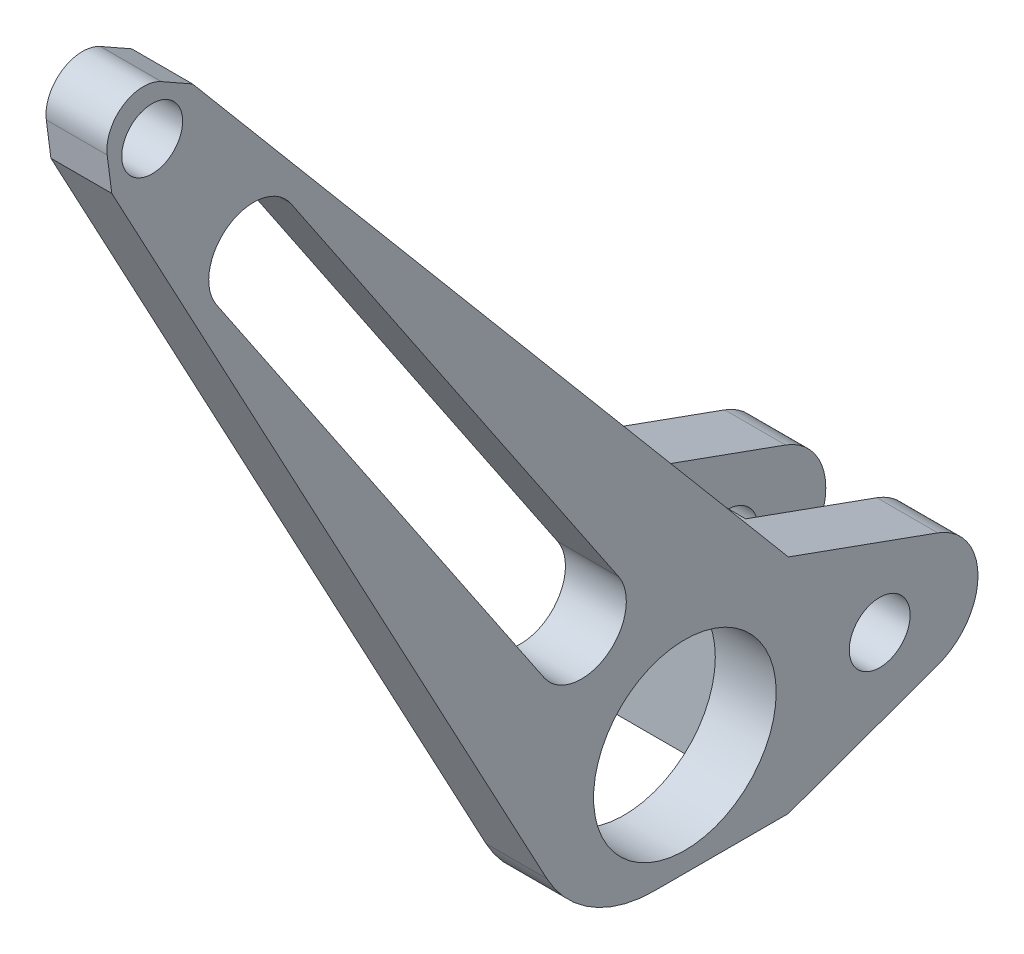
ISO-10303-21;
HEADER;
FILE_DESCRIPTION(('STEP AP214'),'2;1');
FILE_NAME('part.step','',(''),(''),'','','');
FILE_SCHEMA(('AUTOMOTIVE_DESIGN { 1 0 10303 214 1 1 1 1 }'));
ENDSEC;
DATA;
#1=APPLICATION_CONTEXT('core data for automotive mechanical design processes');
#2=APPLICATION_PROTOCOL_DEFINITION('international standard','automotive_design',2000,#1);
#3=PRODUCT_CONTEXT('',#1,'mechanical');
#4=PRODUCT('Part','Part','',(#3));
#5=PRODUCT_RELATED_PRODUCT_CATEGORY('part','',(#4));
#6=PRODUCT_DEFINITION_FORMATION('','',#4);
#7=PRODUCT_DEFINITION_CONTEXT('part definition',#1,'design');
#8=PRODUCT_DEFINITION('design','',#6,#7);
#9=PRODUCT_DEFINITION_SHAPE('','',#8);
#10=(LENGTH_UNIT() NAMED_UNIT(*) SI_UNIT(.MILLI.,.METRE.));
#11=(NAMED_UNIT(*) PLANE_ANGLE_UNIT() SI_UNIT($,.RADIAN.));
#12=(NAMED_UNIT(*) SI_UNIT($,.STERADIAN.) SOLID_ANGLE_UNIT());
#13=UNCERTAINTY_MEASURE_WITH_UNIT(LENGTH_MEASURE(1.E-05),#10,'distance_accuracy_value','');
#14=(GEOMETRIC_REPRESENTATION_CONTEXT(3) GLOBAL_UNCERTAINTY_ASSIGNED_CONTEXT((#13)) GLOBAL_UNIT_ASSIGNED_CONTEXT((#10,
#11,#12)) REPRESENTATION_CONTEXT('',''));
#15=CARTESIAN_POINT('',(0.,0.,0.));
#16=DIRECTION('',(0.,0.,1.));
#17=DIRECTION('',(1.,0.,0.));
#18=AXIS2_PLACEMENT_3D('',#15,#16,#17);
#19=CARTESIAN_POINT('',(-25.,-17.1695442609699,-20.));
#20=DIRECTION('',(0.,0.,-1.));
#21=DIRECTION('',(0.,1.,0.));
#22=AXIS2_PLACEMENT_3D('',#19,#20,#21);
#23=PLANE('',#22);
#24=DIRECTION('',(1.,0.,0.));
#25=VECTOR('',#24,1.);
#26=CARTESIAN_POINT('',(-25.,-17.1695442609699,-20.));
#27=LINE('',#26,#25);
#28=CARTESIAN_POINT('',(-15.,-17.1695442609699,-20.));
#29=VERTEX_POINT('',#28);
#30=CARTESIAN_POINT('',(0.,-17.1695442609699,-20.));
#31=VERTEX_POINT('',#30);
#32=EDGE_CURVE('E56',#29,#31,#27,.T.);
#33=ORIENTED_EDGE('',*,*,#32,.F.);
#34=DIRECTION('',(0.,1.,0.));
#35=VECTOR('',#34,1.);
#36=CARTESIAN_POINT('',(-15.,0.,-20.));
#37=LINE('',#36,#35);
#38=CARTESIAN_POINT('',(-15.,17.16954426097,-20.));
#39=VERTEX_POINT('',#38);
#40=EDGE_CURVE('E51',#29,#39,#37,.T.);
#41=ORIENTED_EDGE('',*,*,#40,.T.);
#42=DIRECTION('',(1.,0.,0.));
#43=VECTOR('',#42,1.);
#44=CARTESIAN_POINT('',(-25.,17.16954426097,-20.));
#45=LINE('',#44,#43);
#46=CARTESIAN_POINT('',(0.,17.16954426097,-20.));
#47=VERTEX_POINT('',#46);
#48=EDGE_CURVE('E208',#39,#47,#45,.T.);
#49=ORIENTED_EDGE('',*,*,#48,.T.);
#50=DIRECTION('',(0.,1.,0.));
#51=VECTOR('',#50,1.);
#52=CARTESIAN_POINT('',(0.,-17.1695442609699,-20.));
#53=LINE('',#52,#51);
#54=EDGE_CURVE('E199',#31,#47,#53,.T.);
#55=ORIENTED_EDGE('',*,*,#54,.F.);
#56=EDGE_LOOP('',(#33,#41,#49,#55));
#57=FACE_BOUND('',#56,.T.);
#58=ADVANCED_FACE('F36',(#57),#23,.T.);
#59=CARTESIAN_POINT('',(0.,0.,-38.1492996902775));
#60=DIRECTION('',(1.,0.,0.));
#61=DIRECTION('',(0.,0.,-1.));
#62=AXIS2_PLACEMENT_3D('',#59,#60,#61);
#63=PLANE('',#62);
#64=CARTESIAN_POINT('',(0.,105.23639134039,70.8321864791089));
#65=DIRECTION('',(1.,0.,0.));
#66=DIRECTION('',(0.,0.,-1.));
#67=AXIS2_PLACEMENT_3D('',#64,#65,#66);
#68=CIRCLE('',#67,7.38136059513586);
#69=CARTESIAN_POINT('',(0.,109.357968664756,64.7087001686234));
#70=VERTEX_POINT('',#69);
#71=CARTESIAN_POINT('',(0.,101.114814016025,76.9556727895943));
#72=VERTEX_POINT('',#71);
#73=EDGE_CURVE('E210',#70,#72,#68,.T.);
#74=ORIENTED_EDGE('',*,*,#73,.T.);
#75=DIRECTION('',(0.,-0.829587747619415,-0.558376368589991));
#76=VECTOR('',#75,1.);
#77=CARTESIAN_POINT('',(0.,101.114814016025,76.9556727895943));
#78=LINE('',#77,#76);
#79=CARTESIAN_POINT('',(0.,21.1355655327776,23.1234863104855));
#80=VERTEX_POINT('',#79);
#81=EDGE_CURVE('E227',#72,#80,#78,.T.);
#82=ORIENTED_EDGE('',*,*,#81,.T.);
#83=CARTESIAN_POINT('',(0.,25.2571428571428,17.));
#84=DIRECTION('',(1.,0.,0.));
#85=DIRECTION('',(0.,0.,-1.));
#86=AXIS2_PLACEMENT_3D('',#83,#84,#85);
#87=CIRCLE('',#86,7.38136059513586);
#88=CARTESIAN_POINT('',(0.,29.3787201815081,10.8765136895145));
#89=VERTEX_POINT('',#88);
#90=EDGE_CURVE('E230',#80,#89,#87,.T.);
#91=ORIENTED_EDGE('',*,*,#90,.T.);
#92=DIRECTION('',(0.,0.829587747619415,0.558376368589991));
#93=VECTOR('',#92,1.);
#94=CARTESIAN_POINT('',(0.,109.357968664756,64.7087001686234));
#95=LINE('',#94,#93);
#96=EDGE_CURVE('E217',#89,#70,#95,.T.);
#97=ORIENTED_EDGE('',*,*,#96,.T.);
#98=EDGE_LOOP('',(#74,#82,#91,#97));
#99=FACE_BOUND('',#98,.T.);
#100=CARTESIAN_POINT('',(0.,0.,0.));
#101=DIRECTION('',(1.,0.,0.));
#102=DIRECTION('',(0.,0.,-1.));
#103=AXIS2_PLACEMENT_3D('',#100,#101,#102);
#104=CIRCLE('',#103,15.);
#105=CARTESIAN_POINT('',(0.,0.,-15.));
#106=VERTEX_POINT('',#105);
#107=EDGE_CURVE('E254',#106,#106,#104,.T.);
#108=ORIENTED_EDGE('',*,*,#107,.T.);
#109=EDGE_LOOP('',(#108));
#110=FACE_BOUND('',#109,.T.);
#111=CARTESIAN_POINT('',(0.,130.,87.5));
#112=DIRECTION('',(1.,0.,0.));
#113=DIRECTION('',(0.,0.,-1.));
#114=AXIS2_PLACEMENT_3D('',#111,#112,#113);
#115=CIRCLE('',#114,5.00000000000001);
#116=CARTESIAN_POINT('',(0.,130.,82.5));
#117=VERTEX_POINT('',#116);
#118=EDGE_CURVE('E248',#117,#117,#115,.T.);
#119=ORIENTED_EDGE('',*,*,#118,.T.);
#120=EDGE_LOOP('',(#119));
#121=FACE_BOUND('',#120,.T.);
#122=DIRECTION('',(0.,0.764921441974797,0.644123581005382));
#123=VECTOR('',#122,1.);
#124=CARTESIAN_POINT('',(0.,134.46701094872,80.8632980190447));
#125=LINE('',#124,#123);
#126=CARTESIAN_POINT('',(0.,18.2505934092546,-17.));
#127=VERTEX_POINT('',#126);
#128=CARTESIAN_POINT('',(0.,134.46701094872,80.8632980190447));
#129=VERTEX_POINT('',#128);
#130=EDGE_CURVE('E260',#127,#129,#125,.T.);
#131=ORIENTED_EDGE('',*,*,#130,.F.);
#132=DIRECTION('',(0.,-1.,0.));
#133=VECTOR('',#132,1.);
#134=CARTESIAN_POINT('',(0.,18.2505934092546,-17.));
#135=LINE('',#134,#133);
#136=CARTESIAN_POINT('',(0.,-18.2505934092547,-17.));
#137=VERTEX_POINT('',#136);
#138=EDGE_CURVE('E195',#127,#137,#135,.T.);
#139=ORIENTED_EDGE('',*,*,#138,.T.);
#140=DIRECTION('',(0.,0.,-1.));
#141=VECTOR('',#140,1.);
#142=CARTESIAN_POINT('',(0.,-18.2505934092547,-17.));
#143=LINE('',#142,#141);
#144=CARTESIAN_POINT('',(0.,-18.2505934092547,5.03322666364754));
#145=VERTEX_POINT('',#144);
#146=EDGE_CURVE('E298',#145,#137,#143,.T.);
#147=ORIENTED_EDGE('',*,*,#146,.F.);
#148=CARTESIAN_POINT('',(0.,1.74940659074534,5.03322666364764));
#149=DIRECTION('',(1.,0.,0.));
#150=DIRECTION('',(0.,0.,-1.));
#151=AXIS2_PLACEMENT_3D('',#148,#149,#150);
#152=CIRCLE('',#151,20.);
#153=CARTESIAN_POINT('',(0.,-7.70547572672104,22.6572216807504));
#154=VERTEX_POINT('',#153);
#155=EDGE_CURVE('E296',#154,#145,#152,.T.);
#156=ORIENTED_EDGE('',*,*,#155,.F.);
#157=DIRECTION('',(0.,-0.881199750855134,-0.472744115873323));
#158=VECTOR('',#157,1.);
#159=CARTESIAN_POINT('',(0.,125.53298905128,94.1367019809553));
#160=LINE('',#159,#158);
#161=CARTESIAN_POINT('',(0.,125.53298905128,94.1367019809553));
#162=VERTEX_POINT('',#161);
#163=EDGE_CURVE('E294',#162,#154,#160,.T.);
#164=ORIENTED_EDGE('',*,*,#163,.F.);
#165=DIRECTION('',(0.,-0.99171934223052,-0.12842408748309));
#166=VECTOR('',#165,1.);
#167=CARTESIAN_POINT('',(0.,131.372771855144,94.8929328476428));
#168=LINE('',#167,#166);
#169=CARTESIAN_POINT('',(0.,131.372771855144,94.8929328476428));
#170=VERTEX_POINT('',#169);
#171=EDGE_CURVE('E292',#170,#162,#168,.T.);
#172=ORIENTED_EDGE('',*,*,#171,.F.);
#173=CARTESIAN_POINT('',(0.,132.143316380043,88.9426167942597));
#174=DIRECTION('',(1.,0.,0.));
#175=DIRECTION('',(0.,0.,-1.));
#176=AXIS2_PLACEMENT_3D('',#173,#174,#175);
#177=CIRCLE('',#176,6.);
#178=CARTESIAN_POINT('',(0.,137.365895937689,85.9888627821486));
#179=VERTEX_POINT('',#178);
#180=EDGE_CURVE('E290',#179,#170,#177,.T.);
#181=ORIENTED_EDGE('',*,*,#180,.F.);
#182=DIRECTION('',(0.,0.492292335351843,0.870429926274269));
#183=VECTOR('',#182,1.);
#184=CARTESIAN_POINT('',(0.,134.46701094872,80.8632980190447));
#185=LINE('',#184,#183);
#186=EDGE_CURVE('E288',#129,#179,#185,.T.);
#187=ORIENTED_EDGE('',*,*,#186,.F.);
#188=EDGE_LOOP('',(#131,#139,#147,#156,#164,#172,#181,#187));
#189=FACE_BOUND('',#188,.T.);
#190=ADVANCED_FACE('F339',(#99,#110,#121,#189),#63,.F.);
#191=CARTESIAN_POINT('',(10.,0.,-38.1492996902775));
#192=DIRECTION('',(1.,0.,0.));
#193=DIRECTION('',(0.,0.,-1.));
#194=AXIS2_PLACEMENT_3D('',#191,#192,#193);
#195=PLANE('',#194);
#196=CARTESIAN_POINT('',(10.,130.,87.5));
#197=DIRECTION('',(1.,0.,0.));
#198=DIRECTION('',(0.,0.,-1.));
#199=AXIS2_PLACEMENT_3D('',#196,#197,#198);
#200=CIRCLE('',#199,5.00000000000001);
#201=CARTESIAN_POINT('',(10.,130.,82.5));
#202=VERTEX_POINT('',#201);
#203=EDGE_CURVE('E251',#202,#202,#200,.T.);
#204=ORIENTED_EDGE('',*,*,#203,.F.);
#205=EDGE_LOOP('',(#204));
#206=FACE_BOUND('',#205,.T.);
#207=DIRECTION('',(0.,0.764921441974797,0.644123581005382));
#208=VECTOR('',#207,1.);
#209=CARTESIAN_POINT('',(10.,134.46701094872,80.8632980190447));
#210=LINE('',#209,#208);
#211=CARTESIAN_POINT('',(10.,18.2505934092547,-17.));
#212=VERTEX_POINT('',#211);
#213=CARTESIAN_POINT('',(10.,134.46701094872,80.8632980190447));
#214=VERTEX_POINT('',#213);
#215=EDGE_CURVE('E263',#212,#214,#210,.T.);
#216=ORIENTED_EDGE('',*,*,#215,.T.);
#217=DIRECTION('',(0.,0.492292335351843,0.870429926274269));
#218=VECTOR('',#217,1.);
#219=CARTESIAN_POINT('',(10.,134.46701094872,80.8632980190447));
#220=LINE('',#219,#218);
#221=CARTESIAN_POINT('',(10.,137.365895937689,85.9888627821486));
#222=VERTEX_POINT('',#221);
#223=EDGE_CURVE('E266',#214,#222,#220,.T.);
#224=ORIENTED_EDGE('',*,*,#223,.T.);
#225=CARTESIAN_POINT('',(10.,132.143316380043,88.9426167942597));
#226=DIRECTION('',(1.,0.,0.));
#227=DIRECTION('',(0.,0.,-1.));
#228=AXIS2_PLACEMENT_3D('',#225,#226,#227);
#229=CIRCLE('',#228,6.);
#230=CARTESIAN_POINT('',(10.,131.372771855144,94.8929328476428));
#231=VERTEX_POINT('',#230);
#232=EDGE_CURVE('E269',#222,#231,#229,.T.);
#233=ORIENTED_EDGE('',*,*,#232,.T.);
#234=DIRECTION('',(0.,-0.99171934223052,-0.12842408748309));
#235=VECTOR('',#234,1.);
#236=CARTESIAN_POINT('',(10.,131.372771855144,94.8929328476428));
#237=LINE('',#236,#235);
#238=CARTESIAN_POINT('',(10.,125.53298905128,94.1367019809553));
#239=VERTEX_POINT('',#238);
#240=EDGE_CURVE('E271',#231,#239,#237,.T.);
#241=ORIENTED_EDGE('',*,*,#240,.T.);
#242=DIRECTION('',(0.,-0.881199750855134,-0.472744115873323));
#243=VECTOR('',#242,1.);
#244=CARTESIAN_POINT('',(10.,125.53298905128,94.1367019809553));
#245=LINE('',#244,#243);
#246=CARTESIAN_POINT('',(10.,-7.70547572672104,22.6572216807504));
#247=VERTEX_POINT('',#246);
#248=EDGE_CURVE('E273',#239,#247,#245,.T.);
#249=ORIENTED_EDGE('',*,*,#248,.T.);
#250=CARTESIAN_POINT('',(10.,1.74940659074534,5.03322666364764));
#251=DIRECTION('',(1.,0.,0.));
#252=DIRECTION('',(0.,0.,-1.));
#253=AXIS2_PLACEMENT_3D('',#250,#251,#252);
#254=CIRCLE('',#253,20.);
#255=CARTESIAN_POINT('',(10.,-18.2505934092547,5.03322666364754));
#256=VERTEX_POINT('',#255);
#257=EDGE_CURVE('E275',#247,#256,#254,.T.);
#258=ORIENTED_EDGE('',*,*,#257,.T.);
#259=DIRECTION('',(0.,0.,-1.));
#260=VECTOR('',#259,1.);
#261=CARTESIAN_POINT('',(10.,-18.2505934092547,-17.));
#262=LINE('',#261,#260);
#263=CARTESIAN_POINT('',(10.,-18.2505934092547,-17.));
#264=VERTEX_POINT('',#263);
#265=EDGE_CURVE('E277',#256,#264,#262,.T.);
#266=ORIENTED_EDGE('',*,*,#265,.T.);
#267=DIRECTION('',(0.,0.339010711592773,-0.940782513350116));
#268=VECTOR('',#267,1.);
#269=CARTESIAN_POINT('',(10.,-9.40782513350104,-41.5394068062052));
#270=LINE('',#269,#268);
#271=CARTESIAN_POINT('',(10.,-9.40782513350115,-41.5394068062053));
#272=VERTEX_POINT('',#271);
#273=EDGE_CURVE('E279',#264,#272,#270,.T.);
#274=ORIENTED_EDGE('',*,*,#273,.T.);
#275=CARTESIAN_POINT('',(10.,0.,-38.1492996902775));
#276=DIRECTION('',(1.,0.,0.));
#277=DIRECTION('',(0.,0.,-1.));
#278=AXIS2_PLACEMENT_3D('',#275,#276,#277);
#279=CIRCLE('',#278,10.);
#280=CARTESIAN_POINT('',(10.,9.40782513350131,-41.5394068062052));
#281=VERTEX_POINT('',#280);
#282=EDGE_CURVE('E281',#272,#281,#279,.T.);
#283=ORIENTED_EDGE('',*,*,#282,.T.);
#284=DIRECTION('',(0.,0.339010711592765,0.940782513350119));
#285=VECTOR('',#284,1.);
#286=CARTESIAN_POINT('',(10.,18.2505934092547,-17.));
#287=LINE('',#286,#285);
#288=EDGE_CURVE('E283',#281,#212,#287,.T.);
#289=ORIENTED_EDGE('',*,*,#288,.T.);
#290=EDGE_LOOP('',(#216,#224,#233,#241,#249,#258,#266,#274,#283,#289));
#291=FACE_BOUND('',#290,.T.);
#292=CARTESIAN_POINT('',(10.,0.,0.));
#293=DIRECTION('',(1.,0.,0.));
#294=DIRECTION('',(0.,0.,-1.));
#295=AXIS2_PLACEMENT_3D('',#292,#293,#294);
#296=CIRCLE('',#295,15.);
#297=CARTESIAN_POINT('',(10.,0.,-15.));
#298=VERTEX_POINT('',#297);
#299=EDGE_CURVE('E257',#298,#298,#296,.T.);
#300=ORIENTED_EDGE('',*,*,#299,.F.);
#301=EDGE_LOOP('',(#300));
#302=FACE_BOUND('',#301,.T.);
#303=CARTESIAN_POINT('',(10.,0.,-32.));
#304=DIRECTION('',(1.,0.,0.));
#305=DIRECTION('',(0.,0.,-1.));
#306=AXIS2_PLACEMENT_3D('',#303,#304,#305);
#307=CIRCLE('',#306,5.);
#308=CARTESIAN_POINT('',(10.,0.,-37.));
#309=VERTEX_POINT('',#308);
#310=EDGE_CURVE('E245',#309,#309,#307,.T.);
#311=ORIENTED_EDGE('',*,*,#310,.F.);
#312=EDGE_LOOP('',(#311));
#313=FACE_BOUND('',#312,.T.);
#314=DIRECTION('',(0.,-0.829587747619415,-0.558376368589991));
#315=VECTOR('',#314,1.);
#316=CARTESIAN_POINT('',(10.,101.114814016025,76.9556727895943));
#317=LINE('',#316,#315);
#318=CARTESIAN_POINT('',(10.,101.114814016025,76.9556727895943));
#319=VERTEX_POINT('',#318);
#320=CARTESIAN_POINT('',(10.,21.1355655327776,23.1234863104855));
#321=VERTEX_POINT('',#320);
#322=EDGE_CURVE('E216',#319,#321,#317,.T.);
#323=ORIENTED_EDGE('',*,*,#322,.F.);
#324=CARTESIAN_POINT('',(10.,105.23639134039,70.8321864791089));
#325=DIRECTION('',(1.,0.,0.));
#326=DIRECTION('',(0.,0.,-1.));
#327=AXIS2_PLACEMENT_3D('',#324,#325,#326);
#328=CIRCLE('',#327,7.38136059513586);
#329=CARTESIAN_POINT('',(10.,109.357968664756,64.7087001686234));
#330=VERTEX_POINT('',#329);
#331=EDGE_CURVE('E214',#330,#319,#328,.T.);
#332=ORIENTED_EDGE('',*,*,#331,.F.);
#333=DIRECTION('',(0.,0.829587747619415,0.558376368589991));
#334=VECTOR('',#333,1.);
#335=CARTESIAN_POINT('',(10.,109.357968664756,64.7087001686234));
#336=LINE('',#335,#334);
#337=CARTESIAN_POINT('',(10.,29.3787201815081,10.8765136895145));
#338=VERTEX_POINT('',#337);
#339=EDGE_CURVE('E222',#338,#330,#336,.T.);
#340=ORIENTED_EDGE('',*,*,#339,.F.);
#341=CARTESIAN_POINT('',(10.,25.2571428571428,17.));
#342=DIRECTION('',(1.,0.,0.));
#343=DIRECTION('',(0.,0.,-1.));
#344=AXIS2_PLACEMENT_3D('',#341,#342,#343);
#345=CIRCLE('',#344,7.38136059513586);
#346=EDGE_CURVE('E219',#321,#338,#345,.T.);
#347=ORIENTED_EDGE('',*,*,#346,.F.);
#348=EDGE_LOOP('',(#323,#332,#340,#347));
#349=FACE_BOUND('',#348,.T.);
#350=ADVANCED_FACE('F352',(#206,#291,#302,#313,#349),#195,.T.);
#351=CARTESIAN_POINT('',(0.,0.,-32.));
#352=DIRECTION('',(1.,0.,0.));
#353=DIRECTION('',(0.,0.,-1.));
#354=AXIS2_PLACEMENT_3D('',#351,#352,#353);
#355=CIRCLE('',#354,5.);
#356=CARTESIAN_POINT('',(0.,0.,-37.));
#357=VERTEX_POINT('',#356);
#358=EDGE_CURVE('E244',#357,#357,#355,.T.);
#359=ORIENTED_EDGE('',*,*,#358,.T.);
#360=EDGE_LOOP('',(#359));
#361=FACE_BOUND('',#360,.T.);
#362=DIRECTION('',(0.,0.339010711592773,-0.940782513350116));
#363=VECTOR('',#362,1.);
#364=CARTESIAN_POINT('',(0.,-9.40782513350104,-41.5394068062052));
#365=LINE('',#364,#363);
#366=CARTESIAN_POINT('',(0.,-9.40782513350115,-41.5394068062053));
#367=VERTEX_POINT('',#366);
#368=EDGE_CURVE('E301',#31,#367,#365,.T.);
#369=ORIENTED_EDGE('',*,*,#368,.F.);
#370=ORIENTED_EDGE('',*,*,#54,.T.);
#371=DIRECTION('',(0.,0.339010711592765,0.940782513350119));
#372=VECTOR('',#371,1.);
#373=CARTESIAN_POINT('',(0.,18.2505934092547,-17.));
#374=LINE('',#373,#372);
#375=CARTESIAN_POINT('',(0.,9.40782513350131,-41.5394068062052));
#376=VERTEX_POINT('',#375);
#377=EDGE_CURVE('E267',#376,#47,#374,.T.);
#378=ORIENTED_EDGE('',*,*,#377,.F.);
#379=CARTESIAN_POINT('',(0.,0.,-38.1492996902775));
#380=DIRECTION('',(1.,0.,0.));
#381=DIRECTION('',(0.,0.,-1.));
#382=AXIS2_PLACEMENT_3D('',#379,#380,#381);
#383=CIRCLE('',#382,10.);
#384=EDGE_CURVE('E303',#367,#376,#383,.T.);
#385=ORIENTED_EDGE('',*,*,#384,.F.);
#386=EDGE_LOOP('',(#369,#370,#378,#385));
#387=FACE_BOUND('',#386,.T.);
#388=ADVANCED_FACE('F397',(#361,#387),#63,.F.);
#389=CARTESIAN_POINT('',(10.,134.46701094872,80.8632980190447));
#390=DIRECTION('',(0.,-0.644123581005382,0.764921441974797));
#391=DIRECTION('',(0.,-0.764921441974798,-0.644123581005382));
#392=AXIS2_PLACEMENT_3D('',#389,#390,#391);
#393=PLANE('',#392);
#394=ORIENTED_EDGE('',*,*,#130,.T.);
#395=DIRECTION('',(-1.,0.,0.));
#396=VECTOR('',#395,1.);
#397=CARTESIAN_POINT('',(10.,134.46701094872,80.8632980190447));
#398=LINE('',#397,#396);
#399=EDGE_CURVE('E11',#214,#129,#398,.T.);
#400=ORIENTED_EDGE('',*,*,#399,.F.);
#401=ORIENTED_EDGE('',*,*,#215,.F.);
#402=DIRECTION('',(-1.,0.,0.));
#403=VECTOR('',#402,1.);
#404=CARTESIAN_POINT('',(10.,18.2505934092547,-17.));
#405=LINE('',#404,#403);
#406=EDGE_CURVE('E285',#212,#127,#405,.T.);
#407=ORIENTED_EDGE('',*,*,#406,.T.);
#408=EDGE_LOOP('',(#394,#400,#401,#407));
#409=FACE_BOUND('',#408,.T.);
#410=ADVANCED_FACE('F38',(#409),#393,.F.);
#411=CARTESIAN_POINT('',(10.,134.46701094872,80.8632980190447));
#412=DIRECTION('',(0.,-0.870429926274269,0.492292335351843));
#413=DIRECTION('',(0.,-0.492292335351843,-0.870429926274269));
#414=AXIS2_PLACEMENT_3D('',#411,#412,#413);
#415=PLANE('',#414);
#416=ORIENTED_EDGE('',*,*,#186,.T.);
#417=DIRECTION('',(-1.,0.,0.));
#418=VECTOR('',#417,1.);
#419=CARTESIAN_POINT('',(10.,137.365895937689,85.9888627821486));
#420=LINE('',#419,#418);
#421=EDGE_CURVE('E44',#222,#179,#420,.T.);
#422=ORIENTED_EDGE('',*,*,#421,.F.);
#423=ORIENTED_EDGE('',*,*,#223,.F.);
#424=ORIENTED_EDGE('',*,*,#399,.T.);
#425=EDGE_LOOP('',(#416,#422,#423,#424));
#426=FACE_BOUND('',#425,.T.);
#427=ADVANCED_FACE('F357',(#426),#415,.F.);
#428=CARTESIAN_POINT('',(10.,132.143316380043,88.9426167942597));
#429=DIRECTION('',(-1.,0.,0.));
#430=DIRECTION('',(0.,0.,1.));
#431=AXIS2_PLACEMENT_3D('',#428,#429,#430);
#432=CYLINDRICAL_SURFACE('',#431,6.);
#433=ORIENTED_EDGE('',*,*,#180,.T.);
#434=DIRECTION('',(-1.,0.,0.));
#435=VECTOR('',#434,1.);
#436=CARTESIAN_POINT('',(10.,131.372771855144,94.8929328476428));
#437=LINE('',#436,#435);
#438=EDGE_CURVE('E326',#231,#170,#437,.T.);
#439=ORIENTED_EDGE('',*,*,#438,.F.);
#440=ORIENTED_EDGE('',*,*,#232,.F.);
#441=ORIENTED_EDGE('',*,*,#421,.T.);
#442=EDGE_LOOP('',(#433,#439,#440,#441));
#443=FACE_BOUND('',#442,.T.);
#444=ADVANCED_FACE('F333',(#443),#432,.T.);
#445=CARTESIAN_POINT('',(10.,131.372771855144,94.8929328476428));
#446=DIRECTION('',(0.,0.12842408748309,-0.99171934223052));
#447=DIRECTION('',(0.,0.99171934223052,0.12842408748309));
#448=AXIS2_PLACEMENT_3D('',#445,#446,#447);
#449=PLANE('',#448);
#450=ORIENTED_EDGE('',*,*,#171,.T.);
#451=DIRECTION('',(-1.,0.,0.));
#452=VECTOR('',#451,1.);
#453=CARTESIAN_POINT('',(10.,125.53298905128,94.1367019809553));
#454=LINE('',#453,#452);
#455=EDGE_CURVE('E323',#239,#162,#454,.T.);
#456=ORIENTED_EDGE('',*,*,#455,.F.);
#457=ORIENTED_EDGE('',*,*,#240,.F.);
#458=ORIENTED_EDGE('',*,*,#438,.T.);
#459=EDGE_LOOP('',(#450,#456,#457,#458));
#460=FACE_BOUND('',#459,.T.);
#461=ADVANCED_FACE('F344',(#460),#449,.F.);
#462=CARTESIAN_POINT('',(10.,125.53298905128,94.1367019809553));
#463=DIRECTION('',(0.,0.472744115873323,-0.881199750855134));
#464=DIRECTION('',(0.,0.881199750855134,0.472744115873323));
#465=AXIS2_PLACEMENT_3D('',#462,#463,#464);
#466=PLANE('',#465);
#467=ORIENTED_EDGE('',*,*,#163,.T.);
#468=DIRECTION('',(-1.,0.,0.));
#469=VECTOR('',#468,1.);
#470=CARTESIAN_POINT('',(10.,-7.70547572672104,22.6572216807504));
#471=LINE('',#470,#469);
#472=EDGE_CURVE('E320',#247,#154,#471,.T.);
#473=ORIENTED_EDGE('',*,*,#472,.F.);
#474=ORIENTED_EDGE('',*,*,#248,.F.);
#475=ORIENTED_EDGE('',*,*,#455,.T.);
#476=EDGE_LOOP('',(#467,#473,#474,#475));
#477=FACE_BOUND('',#476,.T.);
#478=ADVANCED_FACE('F348',(#477),#466,.F.);
#479=CARTESIAN_POINT('',(10.,1.74940659074534,5.03322666364764));
#480=DIRECTION('',(-1.,0.,0.));
#481=DIRECTION('',(0.,0.,1.));
#482=AXIS2_PLACEMENT_3D('',#479,#480,#481);
#483=CYLINDRICAL_SURFACE('',#482,20.);
#484=ORIENTED_EDGE('',*,*,#155,.T.);
#485=DIRECTION('',(-1.,0.,0.));
#486=VECTOR('',#485,1.);
#487=CARTESIAN_POINT('',(10.,-18.2505934092547,5.03322666364754));
#488=LINE('',#487,#486);
#489=EDGE_CURVE('E317',#256,#145,#488,.T.);
#490=ORIENTED_EDGE('',*,*,#489,.F.);
#491=ORIENTED_EDGE('',*,*,#257,.F.);
#492=ORIENTED_EDGE('',*,*,#472,.T.);
#493=EDGE_LOOP('',(#484,#490,#491,#492));
#494=FACE_BOUND('',#493,.T.);
#495=ADVANCED_FACE('F445',(#494),#483,.T.);
#496=CARTESIAN_POINT('',(10.,-18.2505934092547,-17.));
#497=DIRECTION('',(0.,1.,0.));
#498=DIRECTION('',(0.,0.,1.));
#499=AXIS2_PLACEMENT_3D('',#496,#497,#498);
#500=PLANE('',#499);
#501=ORIENTED_EDGE('',*,*,#146,.T.);
#502=DIRECTION('',(-1.,0.,0.));
#503=VECTOR('',#502,1.);
#504=CARTESIAN_POINT('',(10.,-18.2505934092547,-17.));
#505=LINE('',#504,#503);
#506=EDGE_CURVE('E315',#264,#137,#505,.T.);
#507=ORIENTED_EDGE('',*,*,#506,.F.);
#508=ORIENTED_EDGE('',*,*,#265,.F.);
#509=ORIENTED_EDGE('',*,*,#489,.T.);
#510=EDGE_LOOP('',(#501,#507,#508,#509));
#511=FACE_BOUND('',#510,.T.);
#512=ADVANCED_FACE('F365',(#511),#500,.F.);
#513=CARTESIAN_POINT('',(10.,-9.40782513350104,-41.5394068062052));
#514=DIRECTION('',(0.,0.940782513350116,0.339010711592773));
#515=DIRECTION('',(0.,-0.339010711592773,0.940782513350116));
#516=AXIS2_PLACEMENT_3D('',#513,#514,#515);
#517=PLANE('',#516);
#518=ORIENTED_EDGE('',*,*,#506,.T.);
#519=DIRECTION('',(1.,0.,0.));
#520=VECTOR('',#519,1.);
#521=CARTESIAN_POINT('',(-25.,-18.2505934092547,-17.));
#522=LINE('',#521,#520);
#523=CARTESIAN_POINT('',(-25.,-18.2505934092547,-17.));
#524=VERTEX_POINT('',#523);
#525=EDGE_CURVE('E173',#524,#137,#522,.T.);
#526=ORIENTED_EDGE('',*,*,#525,.F.);
#527=DIRECTION('',(0.,0.339010711592768,-0.940782513350118));
#528=VECTOR('',#527,1.);
#529=CARTESIAN_POINT('',(-25.,-18.2505934092547,-17.));
#530=LINE('',#529,#528);
#531=CARTESIAN_POINT('',(-25.,-9.40782513350115,-41.5394068062053));
#532=VERTEX_POINT('',#531);
#533=EDGE_CURVE('E166',#524,#532,#530,.T.);
#534=ORIENTED_EDGE('',*,*,#533,.T.);
#535=DIRECTION('',(1.,0.,0.));
#536=VECTOR('',#535,1.);
#537=CARTESIAN_POINT('',(-25.,-9.40782513350115,-41.5394068062053));
#538=LINE('',#537,#536);
#539=CARTESIAN_POINT('',(-15.,-9.40782513350115,-41.5394068062053));
#540=VERTEX_POINT('',#539);
#541=EDGE_CURVE('E171',#532,#540,#538,.T.);
#542=ORIENTED_EDGE('',*,*,#541,.T.);
#543=DIRECTION('',(0.,-0.339010711592773,0.940782513350116));
#544=VECTOR('',#543,1.);
#545=CARTESIAN_POINT('',(-15.,-21.5749853559555,-7.77453984777046));
#546=LINE('',#545,#544);
#547=EDGE_CURVE('E419',#540,#29,#546,.T.);
#548=ORIENTED_EDGE('',*,*,#547,.T.);
#549=ORIENTED_EDGE('',*,*,#32,.T.);
#550=ORIENTED_EDGE('',*,*,#368,.T.);
#551=DIRECTION('',(-1.,0.,0.));
#552=VECTOR('',#551,1.);
#553=CARTESIAN_POINT('',(10.,-9.40782513350115,-41.5394068062053));
#554=LINE('',#553,#552);
#555=EDGE_CURVE('E312',#272,#367,#554,.T.);
#556=ORIENTED_EDGE('',*,*,#555,.F.);
#557=ORIENTED_EDGE('',*,*,#273,.F.);
#558=EDGE_LOOP('',(#518,#526,#534,#542,#548,#549,#550,#556,#557));
#559=FACE_BOUND('',#558,.T.);
#560=ADVANCED_FACE('F169',(#559),#517,.F.);
#561=CARTESIAN_POINT('',(10.,0.,-38.1492996902775));
#562=DIRECTION('',(-1.,0.,0.));
#563=DIRECTION('',(0.,0.,1.));
#564=AXIS2_PLACEMENT_3D('',#561,#562,#563);
#565=CYLINDRICAL_SURFACE('',#564,10.);
#566=ORIENTED_EDGE('',*,*,#384,.T.);
#567=DIRECTION('',(-1.,0.,0.));
#568=VECTOR('',#567,1.);
#569=CARTESIAN_POINT('',(10.,9.40782513350131,-41.5394068062052));
#570=LINE('',#569,#568);
#571=EDGE_CURVE('E309',#281,#376,#570,.T.);
#572=ORIENTED_EDGE('',*,*,#571,.F.);
#573=ORIENTED_EDGE('',*,*,#282,.F.);
#574=ORIENTED_EDGE('',*,*,#555,.T.);
#575=EDGE_LOOP('',(#566,#572,#573,#574));
#576=FACE_BOUND('',#575,.T.);
#577=ADVANCED_FACE('F373',(#576),#565,.T.);
#578=CARTESIAN_POINT('',(10.,18.2505934092547,-17.));
#579=DIRECTION('',(0.,-0.940782513350119,0.339010711592765));
#580=DIRECTION('',(0.,-0.339010711592765,-0.940782513350119));
#581=AXIS2_PLACEMENT_3D('',#578,#579,#580);
#582=PLANE('',#581);
#583=ORIENTED_EDGE('',*,*,#377,.T.);
#584=ORIENTED_EDGE('',*,*,#48,.F.);
#585=DIRECTION('',(0.,-0.339010711592765,-0.940782513350119));
#586=VECTOR('',#585,1.);
#587=CARTESIAN_POINT('',(-15.,21.5749853559555,-7.77453984777025));
#588=LINE('',#587,#586);
#589=CARTESIAN_POINT('',(-15.,9.4078251335012,-41.5394068062051));
#590=VERTEX_POINT('',#589);
#591=EDGE_CURVE('E415',#39,#590,#588,.T.);
#592=ORIENTED_EDGE('',*,*,#591,.T.);
#593=DIRECTION('',(1.,0.,0.));
#594=VECTOR('',#593,1.);
#595=CARTESIAN_POINT('',(-25.,9.4078251335012,-41.5394068062051));
#596=LINE('',#595,#594);
#597=CARTESIAN_POINT('',(-25.,9.4078251335012,-41.5394068062051));
#598=VERTEX_POINT('',#597);
#599=EDGE_CURVE('E196',#598,#590,#596,.T.);
#600=ORIENTED_EDGE('',*,*,#599,.F.);
#601=DIRECTION('',(0.,0.339010711592758,0.940782513350122));
#602=VECTOR('',#601,1.);
#603=CARTESIAN_POINT('',(-25.,17.16954426097,-20.));
#604=LINE('',#603,#602);
#605=CARTESIAN_POINT('',(-25.,18.2505934092546,-17.));
#606=VERTEX_POINT('',#605);
#607=EDGE_CURVE('E185',#598,#606,#604,.T.);
#608=ORIENTED_EDGE('',*,*,#607,.T.);
#609=DIRECTION('',(1.,0.,0.));
#610=VECTOR('',#609,1.);
#611=CARTESIAN_POINT('',(-25.,18.2505934092546,-17.));
#612=LINE('',#611,#610);
#613=EDGE_CURVE('E177',#606,#127,#612,.T.);
#614=ORIENTED_EDGE('',*,*,#613,.T.);
#615=ORIENTED_EDGE('',*,*,#406,.F.);
#616=ORIENTED_EDGE('',*,*,#288,.F.);
#617=ORIENTED_EDGE('',*,*,#571,.T.);
#618=EDGE_LOOP('',(#583,#584,#592,#600,#608,#614,#615,#616,#617));
#619=FACE_BOUND('',#618,.T.);
#620=ADVANCED_FACE('F377',(#619),#582,.F.);
#621=CARTESIAN_POINT('',(10.,0.,0.));
#622=DIRECTION('',(-1.,0.,0.));
#623=DIRECTION('',(0.,0.,1.));
#624=AXIS2_PLACEMENT_3D('',#621,#622,#623);
#625=CYLINDRICAL_SURFACE('',#624,15.);
#626=ORIENTED_EDGE('',*,*,#299,.T.);
#627=EDGE_LOOP('',(#626));
#628=FACE_BOUND('',#627,.T.);
#629=ORIENTED_EDGE('',*,*,#107,.F.);
#630=EDGE_LOOP('',(#629));
#631=FACE_BOUND('',#630,.T.);
#632=ADVANCED_FACE('F438',(#628,#631),#625,.F.);
#633=CARTESIAN_POINT('',(10.,130.,87.5));
#634=DIRECTION('',(-1.,0.,0.));
#635=DIRECTION('',(0.,0.,1.));
#636=AXIS2_PLACEMENT_3D('',#633,#634,#635);
#637=CYLINDRICAL_SURFACE('',#636,5.00000000000001);
#638=ORIENTED_EDGE('',*,*,#203,.T.);
#639=EDGE_LOOP('',(#638));
#640=FACE_BOUND('',#639,.T.);
#641=ORIENTED_EDGE('',*,*,#118,.F.);
#642=EDGE_LOOP('',(#641));
#643=FACE_BOUND('',#642,.T.);
#644=ADVANCED_FACE('F499',(#640,#643),#637,.F.);
#645=CARTESIAN_POINT('',(10.,0.,-32.));
#646=DIRECTION('',(-1.,0.,0.));
#647=DIRECTION('',(0.,0.,1.));
#648=AXIS2_PLACEMENT_3D('',#645,#646,#647);
#649=CYLINDRICAL_SURFACE('',#648,5.);
#650=ORIENTED_EDGE('',*,*,#310,.T.);
#651=EDGE_LOOP('',(#650));
#652=FACE_BOUND('',#651,.T.);
#653=ORIENTED_EDGE('',*,*,#358,.F.);
#654=EDGE_LOOP('',(#653));
#655=FACE_BOUND('',#654,.T.);
#656=ADVANCED_FACE('F506',(#652,#655),#649,.F.);
#657=CARTESIAN_POINT('',(10.,105.23639134039,70.8321864791089));
#658=DIRECTION('',(-1.,0.,0.));
#659=DIRECTION('',(0.,0.,1.));
#660=AXIS2_PLACEMENT_3D('',#657,#658,#659);
#661=CYLINDRICAL_SURFACE('',#660,7.38136059513586);
#662=ORIENTED_EDGE('',*,*,#73,.F.);
#663=DIRECTION('',(-1.,0.,0.));
#664=VECTOR('',#663,1.);
#665=CARTESIAN_POINT('',(10.,109.357968664756,64.7087001686234));
#666=LINE('',#665,#664);
#667=EDGE_CURVE('E224',#330,#70,#666,.T.);
#668=ORIENTED_EDGE('',*,*,#667,.F.);
#669=ORIENTED_EDGE('',*,*,#331,.T.);
#670=DIRECTION('',(-1.,0.,0.));
#671=VECTOR('',#670,1.);
#672=CARTESIAN_POINT('',(10.,101.114814016025,76.9556727895943));
#673=LINE('',#672,#671);
#674=EDGE_CURVE('E241',#319,#72,#673,.T.);
#675=ORIENTED_EDGE('',*,*,#674,.T.);
#676=EDGE_LOOP('',(#662,#668,#669,#675));
#677=FACE_BOUND('',#676,.T.);
#678=ADVANCED_FACE('F514',(#677),#661,.F.);
#679=CARTESIAN_POINT('',(10.,101.114814016025,76.9556727895943));
#680=DIRECTION('',(0.,0.558376368589991,-0.829587747619415));
#681=DIRECTION('',(0.,0.829587747619415,0.558376368589991));
#682=AXIS2_PLACEMENT_3D('',#679,#680,#681);
#683=PLANE('',#682);
#684=ORIENTED_EDGE('',*,*,#81,.F.);
#685=ORIENTED_EDGE('',*,*,#674,.F.);
#686=ORIENTED_EDGE('',*,*,#322,.T.);
#687=DIRECTION('',(-1.,0.,0.));
#688=VECTOR('',#687,1.);
#689=CARTESIAN_POINT('',(10.,21.1355655327776,23.1234863104855));
#690=LINE('',#689,#688);
#691=EDGE_CURVE('E239',#321,#80,#690,.T.);
#692=ORIENTED_EDGE('',*,*,#691,.T.);
#693=EDGE_LOOP('',(#684,#685,#686,#692));
#694=FACE_BOUND('',#693,.T.);
#695=ADVANCED_FACE('F522',(#694),#683,.T.);
#696=CARTESIAN_POINT('',(10.,25.2571428571428,17.));
#697=DIRECTION('',(-1.,0.,0.));
#698=DIRECTION('',(0.,0.,1.));
#699=AXIS2_PLACEMENT_3D('',#696,#697,#698);
#700=CYLINDRICAL_SURFACE('',#699,7.38136059513586);
#701=ORIENTED_EDGE('',*,*,#90,.F.);
#702=ORIENTED_EDGE('',*,*,#691,.F.);
#703=ORIENTED_EDGE('',*,*,#346,.T.);
#704=DIRECTION('',(-1.,0.,0.));
#705=VECTOR('',#704,1.);
#706=CARTESIAN_POINT('',(10.,29.3787201815081,10.8765136895145));
#707=LINE('',#706,#705);
#708=EDGE_CURVE('E237',#338,#89,#707,.T.);
#709=ORIENTED_EDGE('',*,*,#708,.T.);
#710=EDGE_LOOP('',(#701,#702,#703,#709));
#711=FACE_BOUND('',#710,.T.);
#712=ADVANCED_FACE('F387',(#711),#700,.F.);
#713=CARTESIAN_POINT('',(10.,109.357968664756,64.7087001686234));
#714=DIRECTION('',(0.,-0.558376368589991,0.829587747619415));
#715=DIRECTION('',(0.,-0.829587747619415,-0.558376368589991));
#716=AXIS2_PLACEMENT_3D('',#713,#714,#715);
#717=PLANE('',#716);
#718=ORIENTED_EDGE('',*,*,#96,.F.);
#719=ORIENTED_EDGE('',*,*,#708,.F.);
#720=ORIENTED_EDGE('',*,*,#339,.T.);
#721=ORIENTED_EDGE('',*,*,#667,.T.);
#722=EDGE_LOOP('',(#718,#719,#720,#721));
#723=FACE_BOUND('',#722,.T.);
#724=ADVANCED_FACE('F380',(#723),#717,.T.);
#725=CARTESIAN_POINT('',(-25.,18.2505934092546,-17.));
#726=DIRECTION('',(0.,0.,1.));
#727=DIRECTION('',(0.,-1.,0.));
#728=AXIS2_PLACEMENT_3D('',#725,#726,#727);
#729=PLANE('',#728);
#730=ORIENTED_EDGE('',*,*,#138,.F.);
#731=ORIENTED_EDGE('',*,*,#613,.F.);
#732=DIRECTION('',(0.,-1.,0.));
#733=VECTOR('',#732,1.);
#734=CARTESIAN_POINT('',(-25.,18.2505934092546,-17.));
#735=LINE('',#734,#733);
#736=EDGE_CURVE('E178',#606,#524,#735,.T.);
#737=ORIENTED_EDGE('',*,*,#736,.T.);
#738=ORIENTED_EDGE('',*,*,#525,.T.);
#739=EDGE_LOOP('',(#730,#731,#737,#738));
#740=FACE_BOUND('',#739,.T.);
#741=ADVANCED_FACE('F378',(#740),#729,.T.);
#742=CARTESIAN_POINT('',(-25.,0.,0.));
#743=DIRECTION('',(1.,0.,0.));
#744=DIRECTION('',(0.,0.,-1.));
#745=AXIS2_PLACEMENT_3D('',#742,#743,#744);
#746=PLANE('',#745);
#747=ORIENTED_EDGE('',*,*,#607,.F.);
#748=CARTESIAN_POINT('',(-25.,0.,-38.1492996902775));
#749=DIRECTION('',(-1.,0.,0.));
#750=DIRECTION('',(0.,0.,1.));
#751=AXIS2_PLACEMENT_3D('',#748,#749,#750);
#752=CIRCLE('',#751,10.);
#753=EDGE_CURVE('E181',#598,#532,#752,.T.);
#754=ORIENTED_EDGE('',*,*,#753,.T.);
#755=ORIENTED_EDGE('',*,*,#533,.F.);
#756=ORIENTED_EDGE('',*,*,#736,.F.);
#757=EDGE_LOOP('',(#747,#754,#755,#756));
#758=FACE_BOUND('',#757,.T.);
#759=CARTESIAN_POINT('',(-25.,0.,-32.));
#760=DIRECTION('',(-1.,0.,0.));
#761=DIRECTION('',(0.,0.,1.));
#762=AXIS2_PLACEMENT_3D('',#759,#760,#761);
#763=CIRCLE('',#762,5.);
#764=CARTESIAN_POINT('',(-25.,0.,-27.));
#765=VERTEX_POINT('',#764);
#766=EDGE_CURVE('E189',#765,#765,#763,.F.);
#767=ORIENTED_EDGE('',*,*,#766,.T.);
#768=EDGE_LOOP('',(#767));
#769=FACE_BOUND('',#768,.T.);
#770=ADVANCED_FACE('F182',(#758,#769),#746,.F.);
#771=CARTESIAN_POINT('',(-25.,0.,-38.1492996902775));
#772=DIRECTION('',(1.,0.,0.));
#773=DIRECTION('',(0.,0.,-1.));
#774=AXIS2_PLACEMENT_3D('',#771,#772,#773);
#775=CYLINDRICAL_SURFACE('',#774,10.);
#776=CARTESIAN_POINT('',(-15.,0.,-38.1492996902775));
#777=DIRECTION('',(-1.,0.,0.));
#778=DIRECTION('',(0.,0.,1.));
#779=AXIS2_PLACEMENT_3D('',#776,#777,#778);
#780=CIRCLE('',#779,10.);
#781=EDGE_CURVE('E194',#590,#540,#780,.T.);
#782=ORIENTED_EDGE('',*,*,#781,.T.);
#783=ORIENTED_EDGE('',*,*,#541,.F.);
#784=ORIENTED_EDGE('',*,*,#753,.F.);
#785=ORIENTED_EDGE('',*,*,#599,.T.);
#786=EDGE_LOOP('',(#782,#783,#784,#785));
#787=FACE_BOUND('',#786,.T.);
#788=ADVANCED_FACE('F192',(#787),#775,.T.);
#789=CARTESIAN_POINT('',(-25.,0.,-32.));
#790=DIRECTION('',(1.,0.,0.));
#791=DIRECTION('',(0.,0.,-1.));
#792=AXIS2_PLACEMENT_3D('',#789,#790,#791);
#793=CYLINDRICAL_SURFACE('',#792,5.);
#794=ORIENTED_EDGE('',*,*,#766,.F.);
#795=EDGE_LOOP('',(#794));
#796=FACE_BOUND('',#795,.T.);
#797=CARTESIAN_POINT('',(-15.,0.,-32.));
#798=DIRECTION('',(-1.,0.,0.));
#799=DIRECTION('',(0.,0.,1.));
#800=AXIS2_PLACEMENT_3D('',#797,#798,#799);
#801=CIRCLE('',#800,5.);
#802=CARTESIAN_POINT('',(-15.,0.,-27.));
#803=VERTEX_POINT('',#802);
#804=EDGE_CURVE('E190',#803,#803,#801,.F.);
#805=ORIENTED_EDGE('',*,*,#804,.T.);
#806=EDGE_LOOP('',(#805));
#807=FACE_BOUND('',#806,.T.);
#808=ADVANCED_FACE('F401',(#796,#807),#793,.F.);
#809=CARTESIAN_POINT('',(-15.,0.,0.));
#810=DIRECTION('',(-1.,0.,0.));
#811=DIRECTION('',(0.,0.,1.));
#812=AXIS2_PLACEMENT_3D('',#809,#810,#811);
#813=PLANE('',#812);
#814=ORIENTED_EDGE('',*,*,#781,.F.);
#815=ORIENTED_EDGE('',*,*,#591,.F.);
#816=ORIENTED_EDGE('',*,*,#40,.F.);
#817=ORIENTED_EDGE('',*,*,#547,.F.);
#818=EDGE_LOOP('',(#814,#815,#816,#817));
#819=FACE_BOUND('',#818,.T.);
#820=ORIENTED_EDGE('',*,*,#804,.F.);
#821=EDGE_LOOP('',(#820));
#822=FACE_BOUND('',#821,.T.);
#823=ADVANCED_FACE('F404',(#819,#822),#813,.F.);
#824=CLOSED_SHELL('',(#58,#190,#350,#388,#410,#427,#444,#461,#478,#495,#512,#560,#577,#620,#632,
#644,#656,#678,#695,#712,#724,#741,#770,#788,#808,#823));
#825=MANIFOLD_SOLID_BREP('B2',#824);
#826=ADVANCED_BREP_SHAPE_REPRESENTATION('',(#18,#825),#14);
#827=SHAPE_DEFINITION_REPRESENTATION(#9,#826);
ENDSEC;
END-ISO-10303-21;
